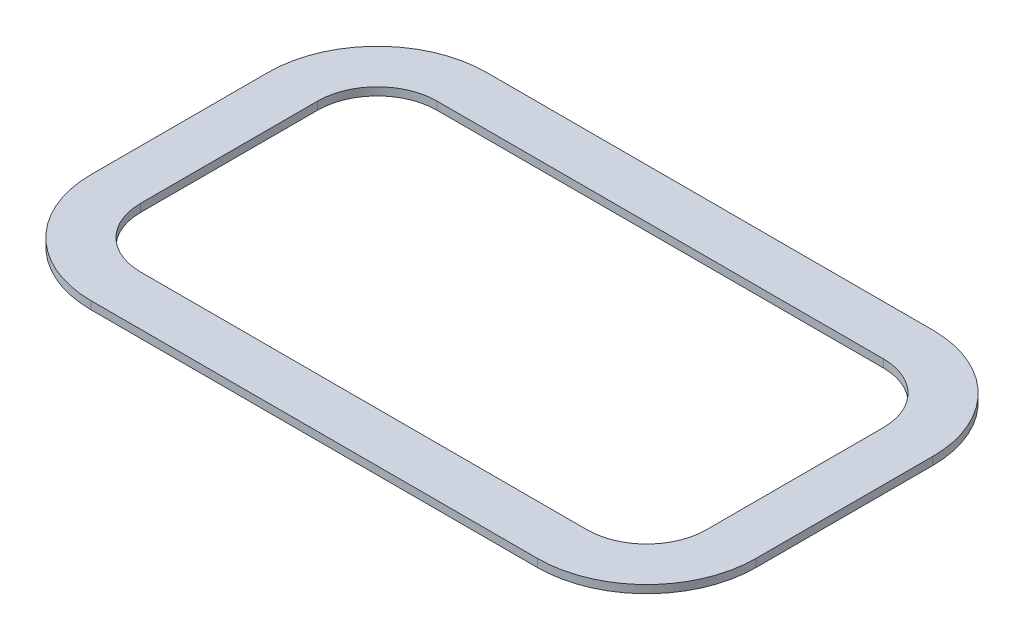
ISO-10303-21;
HEADER;
FILE_DESCRIPTION(('STEP AP214'),'2;1');
FILE_NAME('part.step','',(''),(''),'','','');
FILE_SCHEMA(('AUTOMOTIVE_DESIGN { 1 0 10303 214 1 1 1 1 }'));
ENDSEC;
DATA;
#1=APPLICATION_CONTEXT('core data for automotive mechanical design processes');
#2=APPLICATION_PROTOCOL_DEFINITION('international standard','automotive_design',2000,#1);
#3=PRODUCT_CONTEXT('',#1,'mechanical');
#4=PRODUCT('Part','Part','',(#3));
#5=PRODUCT_RELATED_PRODUCT_CATEGORY('part','',(#4));
#6=PRODUCT_DEFINITION_FORMATION('','',#4);
#7=PRODUCT_DEFINITION_CONTEXT('part definition',#1,'design');
#8=PRODUCT_DEFINITION('design','',#6,#7);
#9=PRODUCT_DEFINITION_SHAPE('','',#8);
#10=(LENGTH_UNIT() NAMED_UNIT(*) SI_UNIT(.MILLI.,.METRE.));
#11=(NAMED_UNIT(*) PLANE_ANGLE_UNIT() SI_UNIT($,.RADIAN.));
#12=(NAMED_UNIT(*) SI_UNIT($,.STERADIAN.) SOLID_ANGLE_UNIT());
#13=UNCERTAINTY_MEASURE_WITH_UNIT(LENGTH_MEASURE(1.E-05),#10,'distance_accuracy_value','');
#14=(GEOMETRIC_REPRESENTATION_CONTEXT(3) GLOBAL_UNCERTAINTY_ASSIGNED_CONTEXT((#13)) GLOBAL_UNIT_ASSIGNED_CONTEXT((#10,
#11,#12)) REPRESENTATION_CONTEXT('',''));
#15=CARTESIAN_POINT('',(0.,0.,0.));
#16=DIRECTION('',(0.,0.,1.));
#17=DIRECTION('',(1.,0.,0.));
#18=AXIS2_PLACEMENT_3D('',#15,#16,#17);
#19=CARTESIAN_POINT('',(0.861185256161669,4.,117.741156845815));
#20=DIRECTION('',(0.,1.,0.));
#21=DIRECTION('',(0.,0.,1.));
#22=AXIS2_PLACEMENT_3D('',#19,#20,#21);
#23=PLANE('',#22);
#24=CARTESIAN_POINT('',(0.861185256161669,4.,117.741156845815));
#25=DIRECTION('',(0.,1.,0.));
#26=DIRECTION('',(0.,0.,1.));
#27=AXIS2_PLACEMENT_3D('',#24,#25,#26);
#28=CIRCLE('',#27,55.);
#29=CARTESIAN_POINT('',(-54.1388147438383,4.,117.741156845814));
#30=VERTEX_POINT('',#29);
#31=CARTESIAN_POINT('',(0.861185256162064,4.,172.741156845815));
#32=VERTEX_POINT('',#31);
#33=EDGE_CURVE('E211',#30,#32,#28,.T.);
#34=ORIENTED_EDGE('',*,*,#33,.T.);
#35=DIRECTION('',(1.,0.,0.));
#36=VECTOR('',#35,1.);
#37=CARTESIAN_POINT('',(0.861185256162064,4.,172.741156845815));
#38=LINE('',#37,#36);
#39=CARTESIAN_POINT('',(225.891185256161,4.,172.741156845815));
#40=VERTEX_POINT('',#39);
#41=EDGE_CURVE('E214',#32,#40,#38,.T.);
#42=ORIENTED_EDGE('',*,*,#41,.T.);
#43=CARTESIAN_POINT('',(225.891185256162,4.,117.741156845815));
#44=DIRECTION('',(0.,1.,0.));
#45=DIRECTION('',(0.,0.,1.));
#46=AXIS2_PLACEMENT_3D('',#43,#44,#45);
#47=CIRCLE('',#46,55.);
#48=CARTESIAN_POINT('',(280.891185256162,4.,117.741156845814));
#49=VERTEX_POINT('',#48);
#50=EDGE_CURVE('E217',#40,#49,#47,.T.);
#51=ORIENTED_EDGE('',*,*,#50,.T.);
#52=DIRECTION('',(0.,0.,-1.));
#53=VECTOR('',#52,1.);
#54=CARTESIAN_POINT('',(280.891185256162,4.,28.4811568458152));
#55=LINE('',#54,#53);
#56=CARTESIAN_POINT('',(280.891185256162,4.,28.4811568458152));
#57=VERTEX_POINT('',#56);
#58=EDGE_CURVE('E219',#49,#57,#55,.T.);
#59=ORIENTED_EDGE('',*,*,#58,.T.);
#60=CARTESIAN_POINT('',(225.891185256162,4.,28.4811568458148));
#61=DIRECTION('',(0.,1.,0.));
#62=DIRECTION('',(0.,0.,-1.));
#63=AXIS2_PLACEMENT_3D('',#60,#61,#62);
#64=CIRCLE('',#63,55.);
#65=CARTESIAN_POINT('',(225.891185256161,4.,-26.5188431541852));
#66=VERTEX_POINT('',#65);
#67=EDGE_CURVE('E221',#57,#66,#64,.T.);
#68=ORIENTED_EDGE('',*,*,#67,.T.);
#69=DIRECTION('',(-1.,0.,0.));
#70=VECTOR('',#69,1.);
#71=CARTESIAN_POINT('',(0.861185256162029,4.,-26.5188431541852));
#72=LINE('',#71,#70);
#73=CARTESIAN_POINT('',(0.861185256162021,4.,-26.5188431541852));
#74=VERTEX_POINT('',#73);
#75=EDGE_CURVE('E223',#66,#74,#72,.T.);
#76=ORIENTED_EDGE('',*,*,#75,.T.);
#77=CARTESIAN_POINT('',(0.861185256161648,4.,28.4811568458148));
#78=DIRECTION('',(0.,1.,0.));
#79=DIRECTION('',(0.,0.,1.));
#80=AXIS2_PLACEMENT_3D('',#77,#78,#79);
#81=CIRCLE('',#80,55.);
#82=CARTESIAN_POINT('',(-54.1388147438383,4.,28.4811568458152));
#83=VERTEX_POINT('',#82);
#84=EDGE_CURVE('E225',#74,#83,#81,.T.);
#85=ORIENTED_EDGE('',*,*,#84,.T.);
#86=DIRECTION('',(0.,0.,1.));
#87=VECTOR('',#86,1.);
#88=CARTESIAN_POINT('',(-54.1388147438383,4.,28.4811568458152));
#89=LINE('',#88,#87);
#90=EDGE_CURVE('E227',#83,#30,#89,.T.);
#91=ORIENTED_EDGE('',*,*,#90,.T.);
#92=EDGE_LOOP('',(#34,#42,#51,#59,#68,#76,#85,#91));
#93=FACE_BOUND('',#92,.T.);
#94=DIRECTION('',(0.,0.,1.));
#95=VECTOR('',#94,1.);
#96=CARTESIAN_POINT('',(-29.1388147438383,4.,28.4811568458152));
#97=LINE('',#96,#95);
#98=CARTESIAN_POINT('',(-29.1388147438383,4.,28.4811568458152));
#99=VERTEX_POINT('',#98);
#100=CARTESIAN_POINT('',(-29.1388147438383,4.,117.741156845815));
#101=VERTEX_POINT('',#100);
#102=EDGE_CURVE('E154',#99,#101,#97,.T.);
#103=ORIENTED_EDGE('',*,*,#102,.F.);
#104=CARTESIAN_POINT('',(0.861185256161648,4.,28.4811568458148));
#105=DIRECTION('',(0.,1.,0.));
#106=DIRECTION('',(0.,0.,1.));
#107=AXIS2_PLACEMENT_3D('',#104,#105,#106);
#108=CIRCLE('',#107,30.);
#109=CARTESIAN_POINT('',(0.861185256162029,4.,-1.51884315418522));
#110=VERTEX_POINT('',#109);
#111=EDGE_CURVE('E146',#110,#99,#108,.T.);
#112=ORIENTED_EDGE('',*,*,#111,.F.);
#113=DIRECTION('',(-1.,0.,0.));
#114=VECTOR('',#113,1.);
#115=CARTESIAN_POINT('',(0.861185256162029,4.,-1.51884315418522));
#116=LINE('',#115,#114);
#117=CARTESIAN_POINT('',(225.891185256161,4.,-1.51884315418523));
#118=VERTEX_POINT('',#117);
#119=EDGE_CURVE('E179',#118,#110,#116,.T.);
#120=ORIENTED_EDGE('',*,*,#119,.F.);
#121=CARTESIAN_POINT('',(225.891185256162,4.,28.4811568458148));
#122=DIRECTION('',(0.,1.,0.));
#123=DIRECTION('',(0.,0.,-1.));
#124=AXIS2_PLACEMENT_3D('',#121,#122,#123);
#125=CIRCLE('',#124,30.);
#126=CARTESIAN_POINT('',(255.891185256162,4.,28.481156845815));
#127=VERTEX_POINT('',#126);
#128=EDGE_CURVE('E177',#127,#118,#125,.T.);
#129=ORIENTED_EDGE('',*,*,#128,.F.);
#130=DIRECTION('',(0.,0.,-1.));
#131=VECTOR('',#130,1.);
#132=CARTESIAN_POINT('',(255.891185256162,4.,28.481156845815));
#133=LINE('',#132,#131);
#134=CARTESIAN_POINT('',(255.891185256162,4.,117.741156845814));
#135=VERTEX_POINT('',#134);
#136=EDGE_CURVE('E175',#135,#127,#133,.T.);
#137=ORIENTED_EDGE('',*,*,#136,.F.);
#138=CARTESIAN_POINT('',(225.891185256162,4.,117.741156845815));
#139=DIRECTION('',(0.,1.,0.));
#140=DIRECTION('',(0.,0.,1.));
#141=AXIS2_PLACEMENT_3D('',#138,#139,#140);
#142=CIRCLE('',#141,30.);
#143=CARTESIAN_POINT('',(225.891185256161,4.,147.741156845815));
#144=VERTEX_POINT('',#143);
#145=EDGE_CURVE('E173',#144,#135,#142,.T.);
#146=ORIENTED_EDGE('',*,*,#145,.F.);
#147=DIRECTION('',(1.,0.,0.));
#148=VECTOR('',#147,1.);
#149=CARTESIAN_POINT('',(0.861185256162064,4.,147.741156845815));
#150=LINE('',#149,#148);
#151=CARTESIAN_POINT('',(0.861185256162064,4.,147.741156845815));
#152=VERTEX_POINT('',#151);
#153=EDGE_CURVE('E169',#152,#144,#150,.T.);
#154=ORIENTED_EDGE('',*,*,#153,.F.);
#155=CARTESIAN_POINT('',(0.861185256161669,4.,117.741156845815));
#156=DIRECTION('',(0.,1.,0.));
#157=DIRECTION('',(0.,0.,1.));
#158=AXIS2_PLACEMENT_3D('',#155,#156,#157);
#159=CIRCLE('',#158,30.);
#160=EDGE_CURVE('E167',#101,#152,#159,.T.);
#161=ORIENTED_EDGE('',*,*,#160,.F.);
#162=EDGE_LOOP('',(#103,#112,#120,#129,#137,#146,#154,#161));
#163=FACE_BOUND('',#162,.T.);
#164=ADVANCED_FACE('F33',(#93,#163),#23,.T.);
#165=CARTESIAN_POINT('',(0.861185256161669,0.,117.741156845815));
#166=DIRECTION('',(0.,1.,0.));
#167=DIRECTION('',(0.,0.,1.));
#168=AXIS2_PLACEMENT_3D('',#165,#166,#167);
#169=PLANE('',#168);
#170=CARTESIAN_POINT('',(0.861185256161669,0.,117.741156845815));
#171=DIRECTION('',(0.,1.,0.));
#172=DIRECTION('',(0.,0.,1.));
#173=AXIS2_PLACEMENT_3D('',#170,#171,#172);
#174=CIRCLE('',#173,55.);
#175=CARTESIAN_POINT('',(-54.1388147438383,0.,117.741156845814));
#176=VERTEX_POINT('',#175);
#177=CARTESIAN_POINT('',(0.861185256162064,0.,172.741156845815));
#178=VERTEX_POINT('',#177);
#179=EDGE_CURVE('E162',#176,#178,#174,.T.);
#180=ORIENTED_EDGE('',*,*,#179,.F.);
#181=DIRECTION('',(0.,0.,1.));
#182=VECTOR('',#181,1.);
#183=CARTESIAN_POINT('',(-54.1388147438383,0.,28.4811568458152));
#184=LINE('',#183,#182);
#185=CARTESIAN_POINT('',(-54.1388147438383,0.,28.4811568458152));
#186=VERTEX_POINT('',#185);
#187=EDGE_CURVE('E215',#186,#176,#184,.T.);
#188=ORIENTED_EDGE('',*,*,#187,.F.);
#189=CARTESIAN_POINT('',(0.861185256161648,0.,28.4811568458148));
#190=DIRECTION('',(0.,1.,0.));
#191=DIRECTION('',(0.,0.,1.));
#192=AXIS2_PLACEMENT_3D('',#189,#190,#191);
#193=CIRCLE('',#192,55.);
#194=CARTESIAN_POINT('',(0.861185256162021,0.,-26.5188431541852));
#195=VERTEX_POINT('',#194);
#196=EDGE_CURVE('E242',#195,#186,#193,.T.);
#197=ORIENTED_EDGE('',*,*,#196,.F.);
#198=DIRECTION('',(-1.,0.,0.));
#199=VECTOR('',#198,1.);
#200=CARTESIAN_POINT('',(0.861185256162029,0.,-26.5188431541852));
#201=LINE('',#200,#199);
#202=CARTESIAN_POINT('',(225.891185256161,0.,-26.5188431541852));
#203=VERTEX_POINT('',#202);
#204=EDGE_CURVE('E240',#203,#195,#201,.T.);
#205=ORIENTED_EDGE('',*,*,#204,.F.);
#206=CARTESIAN_POINT('',(225.891185256162,0.,28.4811568458148));
#207=DIRECTION('',(0.,1.,0.));
#208=DIRECTION('',(0.,0.,-1.));
#209=AXIS2_PLACEMENT_3D('',#206,#207,#208);
#210=CIRCLE('',#209,55.);
#211=CARTESIAN_POINT('',(280.891185256162,0.,28.4811568458152));
#212=VERTEX_POINT('',#211);
#213=EDGE_CURVE('E238',#212,#203,#210,.T.);
#214=ORIENTED_EDGE('',*,*,#213,.F.);
#215=DIRECTION('',(0.,0.,-1.));
#216=VECTOR('',#215,1.);
#217=CARTESIAN_POINT('',(280.891185256162,0.,28.4811568458152));
#218=LINE('',#217,#216);
#219=CARTESIAN_POINT('',(280.891185256162,0.,117.741156845814));
#220=VERTEX_POINT('',#219);
#221=EDGE_CURVE('E236',#220,#212,#218,.T.);
#222=ORIENTED_EDGE('',*,*,#221,.F.);
#223=CARTESIAN_POINT('',(225.891185256162,0.,117.741156845815));
#224=DIRECTION('',(0.,1.,0.));
#225=DIRECTION('',(0.,0.,1.));
#226=AXIS2_PLACEMENT_3D('',#223,#224,#225);
#227=CIRCLE('',#226,55.);
#228=CARTESIAN_POINT('',(225.891185256161,0.,172.741156845815));
#229=VERTEX_POINT('',#228);
#230=EDGE_CURVE('E234',#229,#220,#227,.T.);
#231=ORIENTED_EDGE('',*,*,#230,.F.);
#232=DIRECTION('',(1.,0.,0.));
#233=VECTOR('',#232,1.);
#234=CARTESIAN_POINT('',(0.861185256162064,0.,172.741156845815));
#235=LINE('',#234,#233);
#236=EDGE_CURVE('E232',#178,#229,#235,.T.);
#237=ORIENTED_EDGE('',*,*,#236,.F.);
#238=EDGE_LOOP('',(#180,#188,#197,#205,#214,#222,#231,#237));
#239=FACE_BOUND('',#238,.T.);
#240=CARTESIAN_POINT('',(0.861185256161648,0.,28.4811568458148));
#241=DIRECTION('',(0.,1.,0.));
#242=DIRECTION('',(0.,0.,1.));
#243=AXIS2_PLACEMENT_3D('',#240,#241,#242);
#244=CIRCLE('',#243,30.);
#245=CARTESIAN_POINT('',(0.861185256162029,0.,-1.51884315418523));
#246=VERTEX_POINT('',#245);
#247=CARTESIAN_POINT('',(-29.1388147438383,0.,28.4811568458152));
#248=VERTEX_POINT('',#247);
#249=EDGE_CURVE('E56',#246,#248,#244,.T.);
#250=ORIENTED_EDGE('',*,*,#249,.T.);
#251=DIRECTION('',(0.,0.,1.));
#252=VECTOR('',#251,1.);
#253=CARTESIAN_POINT('',(-29.1388147438383,0.,28.4811568458152));
#254=LINE('',#253,#252);
#255=CARTESIAN_POINT('',(-29.1388147438383,0.,117.741156845815));
#256=VERTEX_POINT('',#255);
#257=EDGE_CURVE('E161',#248,#256,#254,.T.);
#258=ORIENTED_EDGE('',*,*,#257,.T.);
#259=CARTESIAN_POINT('',(0.861185256161669,0.,117.741156845815));
#260=DIRECTION('',(0.,1.,0.));
#261=DIRECTION('',(0.,0.,1.));
#262=AXIS2_PLACEMENT_3D('',#259,#260,#261);
#263=CIRCLE('',#262,30.);
#264=CARTESIAN_POINT('',(0.861185256162064,0.,147.741156845815));
#265=VERTEX_POINT('',#264);
#266=EDGE_CURVE('E183',#256,#265,#263,.T.);
#267=ORIENTED_EDGE('',*,*,#266,.T.);
#268=DIRECTION('',(1.,0.,0.));
#269=VECTOR('',#268,1.);
#270=CARTESIAN_POINT('',(0.861185256162064,0.,147.741156845815));
#271=LINE('',#270,#269);
#272=CARTESIAN_POINT('',(225.891185256161,0.,147.741156845815));
#273=VERTEX_POINT('',#272);
#274=EDGE_CURVE('E186',#265,#273,#271,.T.);
#275=ORIENTED_EDGE('',*,*,#274,.T.);
#276=CARTESIAN_POINT('',(225.891185256162,0.,117.741156845815));
#277=DIRECTION('',(0.,1.,0.));
#278=DIRECTION('',(0.,0.,1.));
#279=AXIS2_PLACEMENT_3D('',#276,#277,#278);
#280=CIRCLE('',#279,30.);
#281=CARTESIAN_POINT('',(255.891185256162,0.,117.741156845814));
#282=VERTEX_POINT('',#281);
#283=EDGE_CURVE('E189',#273,#282,#280,.T.);
#284=ORIENTED_EDGE('',*,*,#283,.T.);
#285=DIRECTION('',(0.,0.,-1.));
#286=VECTOR('',#285,1.);
#287=CARTESIAN_POINT('',(255.891185256162,0.,28.481156845815));
#288=LINE('',#287,#286);
#289=CARTESIAN_POINT('',(255.891185256162,0.,28.481156845815));
#290=VERTEX_POINT('',#289);
#291=EDGE_CURVE('E192',#282,#290,#288,.T.);
#292=ORIENTED_EDGE('',*,*,#291,.T.);
#293=CARTESIAN_POINT('',(225.891185256162,0.,28.4811568458148));
#294=DIRECTION('',(0.,1.,0.));
#295=DIRECTION('',(0.,0.,-1.));
#296=AXIS2_PLACEMENT_3D('',#293,#294,#295);
#297=CIRCLE('',#296,30.);
#298=CARTESIAN_POINT('',(225.891185256161,0.,-1.51884315418522));
#299=VERTEX_POINT('',#298);
#300=EDGE_CURVE('E195',#290,#299,#297,.T.);
#301=ORIENTED_EDGE('',*,*,#300,.T.);
#302=DIRECTION('',(-1.,0.,0.));
#303=VECTOR('',#302,1.);
#304=CARTESIAN_POINT('',(0.861185256162029,0.,-1.51884315418522));
#305=LINE('',#304,#303);
#306=EDGE_CURVE('E155',#299,#246,#305,.T.);
#307=ORIENTED_EDGE('',*,*,#306,.T.);
#308=EDGE_LOOP('',(#250,#258,#267,#275,#284,#292,#301,#307));
#309=FACE_BOUND('',#308,.T.);
#310=ADVANCED_FACE('F272',(#239,#309),#169,.F.);
#311=CARTESIAN_POINT('',(0.861185256161669,4.,117.741156845815));
#312=DIRECTION('',(0.,-1.,0.));
#313=DIRECTION('',(0.,0.,-1.));
#314=AXIS2_PLACEMENT_3D('',#311,#312,#313);
#315=CYLINDRICAL_SURFACE('',#314,55.);
#316=ORIENTED_EDGE('',*,*,#179,.T.);
#317=DIRECTION('',(0.,-1.,0.));
#318=VECTOR('',#317,1.);
#319=CARTESIAN_POINT('',(0.861185256162064,4.,172.741156845815));
#320=LINE('',#319,#318);
#321=EDGE_CURVE('E11',#32,#178,#320,.T.);
#322=ORIENTED_EDGE('',*,*,#321,.F.);
#323=ORIENTED_EDGE('',*,*,#33,.F.);
#324=DIRECTION('',(0.,-1.,0.));
#325=VECTOR('',#324,1.);
#326=CARTESIAN_POINT('',(-54.1388147438383,4.,117.741156845814));
#327=LINE('',#326,#325);
#328=EDGE_CURVE('E229',#30,#176,#327,.T.);
#329=ORIENTED_EDGE('',*,*,#328,.T.);
#330=EDGE_LOOP('',(#316,#322,#323,#329));
#331=FACE_BOUND('',#330,.T.);
#332=ADVANCED_FACE('F35',(#331),#315,.T.);
#333=CARTESIAN_POINT('',(0.861185256162064,4.,172.741156845815));
#334=DIRECTION('',(0.,0.,-1.));
#335=DIRECTION('',(-1.,0.,0.));
#336=AXIS2_PLACEMENT_3D('',#333,#334,#335);
#337=PLANE('',#336);
#338=ORIENTED_EDGE('',*,*,#236,.T.);
#339=DIRECTION('',(0.,-1.,0.));
#340=VECTOR('',#339,1.);
#341=CARTESIAN_POINT('',(225.891185256161,4.,172.741156845815));
#342=LINE('',#341,#340);
#343=EDGE_CURVE('E41',#40,#229,#342,.T.);
#344=ORIENTED_EDGE('',*,*,#343,.F.);
#345=ORIENTED_EDGE('',*,*,#41,.F.);
#346=ORIENTED_EDGE('',*,*,#321,.T.);
#347=EDGE_LOOP('',(#338,#344,#345,#346));
#348=FACE_BOUND('',#347,.T.);
#349=ADVANCED_FACE('F289',(#348),#337,.F.);
#350=CARTESIAN_POINT('',(225.891185256162,4.,117.741156845815));
#351=DIRECTION('',(0.,-1.,0.));
#352=DIRECTION('',(0.,0.,-1.));
#353=AXIS2_PLACEMENT_3D('',#350,#351,#352);
#354=CYLINDRICAL_SURFACE('',#353,55.);
#355=ORIENTED_EDGE('',*,*,#230,.T.);
#356=DIRECTION('',(0.,-1.,0.));
#357=VECTOR('',#356,1.);
#358=CARTESIAN_POINT('',(280.891185256162,4.,117.741156845814));
#359=LINE('',#358,#357);
#360=EDGE_CURVE('E259',#49,#220,#359,.T.);
#361=ORIENTED_EDGE('',*,*,#360,.F.);
#362=ORIENTED_EDGE('',*,*,#50,.F.);
#363=ORIENTED_EDGE('',*,*,#343,.T.);
#364=EDGE_LOOP('',(#355,#361,#362,#363));
#365=FACE_BOUND('',#364,.T.);
#366=ADVANCED_FACE('F266',(#365),#354,.T.);
#367=CARTESIAN_POINT('',(280.891185256162,4.,28.4811568458152));
#368=DIRECTION('',(-1.,0.,0.));
#369=DIRECTION('',(0.,0.,1.));
#370=AXIS2_PLACEMENT_3D('',#367,#368,#369);
#371=PLANE('',#370);
#372=ORIENTED_EDGE('',*,*,#221,.T.);
#373=DIRECTION('',(0.,-1.,0.));
#374=VECTOR('',#373,1.);
#375=CARTESIAN_POINT('',(280.891185256162,4.,28.4811568458152));
#376=LINE('',#375,#374);
#377=EDGE_CURVE('E256',#57,#212,#376,.T.);
#378=ORIENTED_EDGE('',*,*,#377,.F.);
#379=ORIENTED_EDGE('',*,*,#58,.F.);
#380=ORIENTED_EDGE('',*,*,#360,.T.);
#381=EDGE_LOOP('',(#372,#378,#379,#380));
#382=FACE_BOUND('',#381,.T.);
#383=ADVANCED_FACE('F278',(#382),#371,.F.);
#384=CARTESIAN_POINT('',(225.891185256162,4.,28.4811568458148));
#385=DIRECTION('',(0.,-1.,0.));
#386=DIRECTION('',(0.,0.,-1.));
#387=AXIS2_PLACEMENT_3D('',#384,#385,#386);
#388=CYLINDRICAL_SURFACE('',#387,55.);
#389=ORIENTED_EDGE('',*,*,#213,.T.);
#390=DIRECTION('',(0.,-1.,0.));
#391=VECTOR('',#390,1.);
#392=CARTESIAN_POINT('',(225.891185256161,4.,-26.5188431541852));
#393=LINE('',#392,#391);
#394=EDGE_CURVE('E253',#66,#203,#393,.T.);
#395=ORIENTED_EDGE('',*,*,#394,.F.);
#396=ORIENTED_EDGE('',*,*,#67,.F.);
#397=ORIENTED_EDGE('',*,*,#377,.T.);
#398=EDGE_LOOP('',(#389,#395,#396,#397));
#399=FACE_BOUND('',#398,.T.);
#400=ADVANCED_FACE('F282',(#399),#388,.T.);
#401=CARTESIAN_POINT('',(0.861185256162029,4.,-26.5188431541852));
#402=DIRECTION('',(0.,0.,1.));
#403=DIRECTION('',(1.,0.,0.));
#404=AXIS2_PLACEMENT_3D('',#401,#402,#403);
#405=PLANE('',#404);
#406=ORIENTED_EDGE('',*,*,#204,.T.);
#407=DIRECTION('',(0.,-1.,0.));
#408=VECTOR('',#407,1.);
#409=CARTESIAN_POINT('',(0.861185256162021,4.,-26.5188431541852));
#410=LINE('',#409,#408);
#411=EDGE_CURVE('E250',#74,#195,#410,.T.);
#412=ORIENTED_EDGE('',*,*,#411,.F.);
#413=ORIENTED_EDGE('',*,*,#75,.F.);
#414=ORIENTED_EDGE('',*,*,#394,.T.);
#415=EDGE_LOOP('',(#406,#412,#413,#414));
#416=FACE_BOUND('',#415,.T.);
#417=ADVANCED_FACE('F302',(#416),#405,.F.);
#418=CARTESIAN_POINT('',(0.861185256161648,4.,28.4811568458148));
#419=DIRECTION('',(0.,-1.,0.));
#420=DIRECTION('',(0.,0.,-1.));
#421=AXIS2_PLACEMENT_3D('',#418,#419,#420);
#422=CYLINDRICAL_SURFACE('',#421,55.);
#423=ORIENTED_EDGE('',*,*,#196,.T.);
#424=DIRECTION('',(0.,-1.,0.));
#425=VECTOR('',#424,1.);
#426=CARTESIAN_POINT('',(-54.1388147438383,4.,28.4811568458152));
#427=LINE('',#426,#425);
#428=EDGE_CURVE('E247',#83,#186,#427,.T.);
#429=ORIENTED_EDGE('',*,*,#428,.F.);
#430=ORIENTED_EDGE('',*,*,#84,.F.);
#431=ORIENTED_EDGE('',*,*,#411,.T.);
#432=EDGE_LOOP('',(#423,#429,#430,#431));
#433=FACE_BOUND('',#432,.T.);
#434=ADVANCED_FACE('F300',(#433),#422,.T.);
#435=CARTESIAN_POINT('',(-54.1388147438383,4.,28.4811568458152));
#436=DIRECTION('',(1.,0.,0.));
#437=DIRECTION('',(0.,0.,-1.));
#438=AXIS2_PLACEMENT_3D('',#435,#436,#437);
#439=PLANE('',#438);
#440=ORIENTED_EDGE('',*,*,#187,.T.);
#441=ORIENTED_EDGE('',*,*,#328,.F.);
#442=ORIENTED_EDGE('',*,*,#90,.F.);
#443=ORIENTED_EDGE('',*,*,#428,.T.);
#444=EDGE_LOOP('',(#440,#441,#442,#443));
#445=FACE_BOUND('',#444,.T.);
#446=ADVANCED_FACE('F295',(#445),#439,.F.);
#447=CARTESIAN_POINT('',(0.861185256161648,4.,28.4811568458148));
#448=DIRECTION('',(0.,-1.,0.));
#449=DIRECTION('',(0.,0.,-1.));
#450=AXIS2_PLACEMENT_3D('',#447,#448,#449);
#451=CYLINDRICAL_SURFACE('',#450,30.);
#452=ORIENTED_EDGE('',*,*,#249,.F.);
#453=DIRECTION('',(0.,-1.,0.));
#454=VECTOR('',#453,1.);
#455=CARTESIAN_POINT('',(0.861185256162029,4.,-1.51884315418522));
#456=LINE('',#455,#454);
#457=EDGE_CURVE('E150',#110,#246,#456,.T.);
#458=ORIENTED_EDGE('',*,*,#457,.F.);
#459=ORIENTED_EDGE('',*,*,#111,.T.);
#460=DIRECTION('',(0.,-1.,0.));
#461=VECTOR('',#460,1.);
#462=CARTESIAN_POINT('',(-29.1388147438383,4.,28.4811568458152));
#463=LINE('',#462,#461);
#464=EDGE_CURVE('E149',#99,#248,#463,.T.);
#465=ORIENTED_EDGE('',*,*,#464,.T.);
#466=EDGE_LOOP('',(#452,#458,#459,#465));
#467=FACE_BOUND('',#466,.T.);
#468=ADVANCED_FACE('F148',(#467),#451,.F.);
#469=CARTESIAN_POINT('',(-29.1388147438383,4.,28.4811568458152));
#470=DIRECTION('',(1.,0.,0.));
#471=DIRECTION('',(0.,0.,-1.));
#472=AXIS2_PLACEMENT_3D('',#469,#470,#471);
#473=PLANE('',#472);
#474=ORIENTED_EDGE('',*,*,#257,.F.);
#475=ORIENTED_EDGE('',*,*,#464,.F.);
#476=ORIENTED_EDGE('',*,*,#102,.T.);
#477=DIRECTION('',(0.,-1.,0.));
#478=VECTOR('',#477,1.);
#479=CARTESIAN_POINT('',(-29.1388147438383,4.,117.741156845815));
#480=LINE('',#479,#478);
#481=EDGE_CURVE('E163',#101,#256,#480,.T.);
#482=ORIENTED_EDGE('',*,*,#481,.T.);
#483=EDGE_LOOP('',(#474,#475,#476,#482));
#484=FACE_BOUND('',#483,.T.);
#485=ADVANCED_FACE('F158',(#484),#473,.T.);
#486=CARTESIAN_POINT('',(0.861185256161669,4.,117.741156845815));
#487=DIRECTION('',(0.,-1.,0.));
#488=DIRECTION('',(0.,0.,-1.));
#489=AXIS2_PLACEMENT_3D('',#486,#487,#488);
#490=CYLINDRICAL_SURFACE('',#489,30.);
#491=ORIENTED_EDGE('',*,*,#266,.F.);
#492=ORIENTED_EDGE('',*,*,#481,.F.);
#493=ORIENTED_EDGE('',*,*,#160,.T.);
#494=DIRECTION('',(0.,-1.,0.));
#495=VECTOR('',#494,1.);
#496=CARTESIAN_POINT('',(0.861185256162064,4.,147.741156845815));
#497=LINE('',#496,#495);
#498=EDGE_CURVE('E208',#152,#265,#497,.T.);
#499=ORIENTED_EDGE('',*,*,#498,.T.);
#500=EDGE_LOOP('',(#491,#492,#493,#499));
#501=FACE_BOUND('',#500,.T.);
#502=ADVANCED_FACE('F327',(#501),#490,.F.);
#503=CARTESIAN_POINT('',(0.861185256162064,4.,147.741156845815));
#504=DIRECTION('',(0.,0.,-1.));
#505=DIRECTION('',(-1.,0.,0.));
#506=AXIS2_PLACEMENT_3D('',#503,#504,#505);
#507=PLANE('',#506);
#508=ORIENTED_EDGE('',*,*,#274,.F.);
#509=ORIENTED_EDGE('',*,*,#498,.F.);
#510=ORIENTED_EDGE('',*,*,#153,.T.);
#511=DIRECTION('',(0.,-1.,0.));
#512=VECTOR('',#511,1.);
#513=CARTESIAN_POINT('',(225.891185256161,4.,147.741156845815));
#514=LINE('',#513,#512);
#515=EDGE_CURVE('E206',#144,#273,#514,.T.);
#516=ORIENTED_EDGE('',*,*,#515,.T.);
#517=EDGE_LOOP('',(#508,#509,#510,#516));
#518=FACE_BOUND('',#517,.T.);
#519=ADVANCED_FACE('F331',(#518),#507,.T.);
#520=CARTESIAN_POINT('',(225.891185256162,4.,117.741156845815));
#521=DIRECTION('',(0.,-1.,0.));
#522=DIRECTION('',(0.,0.,-1.));
#523=AXIS2_PLACEMENT_3D('',#520,#521,#522);
#524=CYLINDRICAL_SURFACE('',#523,30.);
#525=ORIENTED_EDGE('',*,*,#283,.F.);
#526=ORIENTED_EDGE('',*,*,#515,.F.);
#527=ORIENTED_EDGE('',*,*,#145,.T.);
#528=DIRECTION('',(0.,-1.,0.));
#529=VECTOR('',#528,1.);
#530=CARTESIAN_POINT('',(255.891185256162,4.,117.741156845814));
#531=LINE('',#530,#529);
#532=EDGE_CURVE('E204',#135,#282,#531,.T.);
#533=ORIENTED_EDGE('',*,*,#532,.T.);
#534=EDGE_LOOP('',(#525,#526,#527,#533));
#535=FACE_BOUND('',#534,.T.);
#536=ADVANCED_FACE('F337',(#535),#524,.F.);
#537=CARTESIAN_POINT('',(255.891185256162,4.,28.481156845815));
#538=DIRECTION('',(-1.,0.,0.));
#539=DIRECTION('',(0.,0.,1.));
#540=AXIS2_PLACEMENT_3D('',#537,#538,#539);
#541=PLANE('',#540);
#542=ORIENTED_EDGE('',*,*,#291,.F.);
#543=ORIENTED_EDGE('',*,*,#532,.F.);
#544=ORIENTED_EDGE('',*,*,#136,.T.);
#545=DIRECTION('',(0.,-1.,0.));
#546=VECTOR('',#545,1.);
#547=CARTESIAN_POINT('',(255.891185256162,4.,28.481156845815));
#548=LINE('',#547,#546);
#549=EDGE_CURVE('E202',#127,#290,#548,.T.);
#550=ORIENTED_EDGE('',*,*,#549,.T.);
#551=EDGE_LOOP('',(#542,#543,#544,#550));
#552=FACE_BOUND('',#551,.T.);
#553=ADVANCED_FACE('F341',(#552),#541,.T.);
#554=CARTESIAN_POINT('',(225.891185256162,4.,28.4811568458148));
#555=DIRECTION('',(0.,-1.,0.));
#556=DIRECTION('',(0.,0.,-1.));
#557=AXIS2_PLACEMENT_3D('',#554,#555,#556);
#558=CYLINDRICAL_SURFACE('',#557,30.);
#559=ORIENTED_EDGE('',*,*,#300,.F.);
#560=ORIENTED_EDGE('',*,*,#549,.F.);
#561=ORIENTED_EDGE('',*,*,#128,.T.);
#562=DIRECTION('',(0.,-1.,0.));
#563=VECTOR('',#562,1.);
#564=CARTESIAN_POINT('',(225.891185256161,4.,-1.51884315418522));
#565=LINE('',#564,#563);
#566=EDGE_CURVE('E48',#118,#299,#565,.T.);
#567=ORIENTED_EDGE('',*,*,#566,.T.);
#568=EDGE_LOOP('',(#559,#560,#561,#567));
#569=FACE_BOUND('',#568,.T.);
#570=ADVANCED_FACE('F345',(#569),#558,.F.);
#571=CARTESIAN_POINT('',(0.861185256162029,4.,-1.51884315418522));
#572=DIRECTION('',(0.,0.,1.));
#573=DIRECTION('',(1.,0.,0.));
#574=AXIS2_PLACEMENT_3D('',#571,#572,#573);
#575=PLANE('',#574);
#576=ORIENTED_EDGE('',*,*,#306,.F.);
#577=ORIENTED_EDGE('',*,*,#566,.F.);
#578=ORIENTED_EDGE('',*,*,#119,.T.);
#579=ORIENTED_EDGE('',*,*,#457,.T.);
#580=EDGE_LOOP('',(#576,#577,#578,#579));
#581=FACE_BOUND('',#580,.T.);
#582=ADVANCED_FACE('F349',(#581),#575,.T.);
#583=CLOSED_SHELL('',(#164,#310,#332,#349,#366,#383,#400,#417,#434,#446,#468,#485,#502,#519,
#536,#553,#570,#582));
#584=MANIFOLD_SOLID_BREP('B2',#583);
#585=ADVANCED_BREP_SHAPE_REPRESENTATION('',(#18,#584),#14);
#586=SHAPE_DEFINITION_REPRESENTATION(#9,#585);
ENDSEC;
END-ISO-10303-21;
